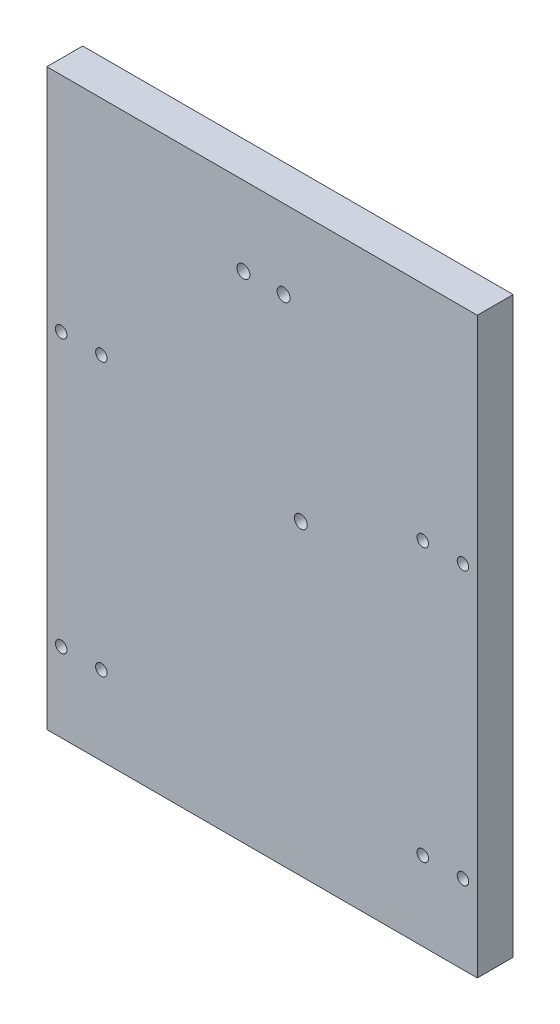
ISO-10303-21;
HEADER;
FILE_DESCRIPTION(('STEP AP214'),'2;1');
FILE_NAME('part.step','',(''),(''),'','','');
FILE_SCHEMA(('AUTOMOTIVE_DESIGN { 1 0 10303 214 1 1 1 1 }'));
ENDSEC;
DATA;
#1=APPLICATION_CONTEXT('core data for automotive mechanical design processes');
#2=APPLICATION_PROTOCOL_DEFINITION('international standard','automotive_design',2000,#1);
#3=PRODUCT_CONTEXT('',#1,'mechanical');
#4=PRODUCT('Part','Part','',(#3));
#5=PRODUCT_RELATED_PRODUCT_CATEGORY('part','',(#4));
#6=PRODUCT_DEFINITION_FORMATION('','',#4);
#7=PRODUCT_DEFINITION_CONTEXT('part definition',#1,'design');
#8=PRODUCT_DEFINITION('design','',#6,#7);
#9=PRODUCT_DEFINITION_SHAPE('','',#8);
#10=(LENGTH_UNIT() NAMED_UNIT(*) SI_UNIT(.MILLI.,.METRE.));
#11=(NAMED_UNIT(*) PLANE_ANGLE_UNIT() SI_UNIT($,.RADIAN.));
#12=(NAMED_UNIT(*) SI_UNIT($,.STERADIAN.) SOLID_ANGLE_UNIT());
#13=UNCERTAINTY_MEASURE_WITH_UNIT(LENGTH_MEASURE(1.E-05),#10,'distance_accuracy_value','');
#14=(GEOMETRIC_REPRESENTATION_CONTEXT(3) GLOBAL_UNCERTAINTY_ASSIGNED_CONTEXT((#13)) GLOBAL_UNIT_ASSIGNED_CONTEXT((#10,
#11,#12)) REPRESENTATION_CONTEXT('',''));
#15=CARTESIAN_POINT('',(0.,0.,0.));
#16=DIRECTION('',(0.,0.,1.));
#17=DIRECTION('',(1.,0.,0.));
#18=AXIS2_PLACEMENT_3D('',#15,#16,#17);
#19=CARTESIAN_POINT('',(150.,200.,-25.));
#20=DIRECTION('',(1.,0.,0.));
#21=DIRECTION('',(0.,1.,0.));
#22=AXIS2_PLACEMENT_3D('',#19,#20,#21);
#23=PLANE('',#22);
#24=DIRECTION('',(0.,1.,0.));
#25=VECTOR('',#24,1.);
#26=CARTESIAN_POINT('',(150.,200.,0.));
#27=LINE('',#26,#25);
#28=CARTESIAN_POINT('',(150.,-200.,0.));
#29=VERTEX_POINT('',#28);
#30=CARTESIAN_POINT('',(150.,200.,0.));
#31=VERTEX_POINT('',#30);
#32=EDGE_CURVE('E110',#29,#31,#27,.T.);
#33=ORIENTED_EDGE('',*,*,#32,.F.);
#34=DIRECTION('',(0.,0.,1.));
#35=VECTOR('',#34,1.);
#36=CARTESIAN_POINT('',(150.,-200.,-25.));
#37=LINE('',#36,#35);
#38=CARTESIAN_POINT('',(150.,-200.,-25.));
#39=VERTEX_POINT('',#38);
#40=EDGE_CURVE('E11',#39,#29,#37,.T.);
#41=ORIENTED_EDGE('',*,*,#40,.F.);
#42=DIRECTION('',(0.,1.,0.));
#43=VECTOR('',#42,1.);
#44=CARTESIAN_POINT('',(150.,200.,-25.));
#45=LINE('',#44,#43);
#46=CARTESIAN_POINT('',(150.,200.,-25.));
#47=VERTEX_POINT('',#46);
#48=EDGE_CURVE('E101',#39,#47,#45,.T.);
#49=ORIENTED_EDGE('',*,*,#48,.T.);
#50=DIRECTION('',(0.,0.,1.));
#51=VECTOR('',#50,1.);
#52=CARTESIAN_POINT('',(150.,200.,-25.));
#53=LINE('',#52,#51);
#54=EDGE_CURVE('E42',#47,#31,#53,.T.);
#55=ORIENTED_EDGE('',*,*,#54,.T.);
#56=EDGE_LOOP('',(#33,#41,#49,#55));
#57=FACE_BOUND('',#56,.T.);
#58=ADVANCED_FACE('F39',(#57),#23,.T.);
#59=CARTESIAN_POINT('',(-150.,-200.,-25.));
#60=DIRECTION('',(0.,-1.,0.));
#61=DIRECTION('',(0.,0.,-1.));
#62=AXIS2_PLACEMENT_3D('',#59,#60,#61);
#63=PLANE('',#62);
#64=DIRECTION('',(1.,0.,0.));
#65=VECTOR('',#64,1.);
#66=CARTESIAN_POINT('',(-150.,-200.,0.));
#67=LINE('',#66,#65);
#68=CARTESIAN_POINT('',(-150.,-200.,0.));
#69=VERTEX_POINT('',#68);
#70=EDGE_CURVE('E104',#69,#29,#67,.T.);
#71=ORIENTED_EDGE('',*,*,#70,.F.);
#72=DIRECTION('',(0.,0.,1.));
#73=VECTOR('',#72,1.);
#74=CARTESIAN_POINT('',(-150.,-200.,-25.));
#75=LINE('',#74,#73);
#76=CARTESIAN_POINT('',(-150.,-200.,-25.));
#77=VERTEX_POINT('',#76);
#78=EDGE_CURVE('E49',#77,#69,#75,.T.);
#79=ORIENTED_EDGE('',*,*,#78,.F.);
#80=DIRECTION('',(1.,0.,0.));
#81=VECTOR('',#80,1.);
#82=CARTESIAN_POINT('',(-150.,-200.,-25.));
#83=LINE('',#82,#81);
#84=EDGE_CURVE('E96',#77,#39,#83,.T.);
#85=ORIENTED_EDGE('',*,*,#84,.T.);
#86=ORIENTED_EDGE('',*,*,#40,.T.);
#87=EDGE_LOOP('',(#71,#79,#85,#86));
#88=FACE_BOUND('',#87,.T.);
#89=ADVANCED_FACE('F127',(#88),#63,.T.);
#90=CARTESIAN_POINT('',(-150.,200.,-25.));
#91=DIRECTION('',(-1.,0.,0.));
#92=DIRECTION('',(0.,-1.,0.));
#93=AXIS2_PLACEMENT_3D('',#90,#91,#92);
#94=PLANE('',#93);
#95=DIRECTION('',(0.,-1.,0.));
#96=VECTOR('',#95,1.);
#97=CARTESIAN_POINT('',(-150.,200.,0.));
#98=LINE('',#97,#96);
#99=CARTESIAN_POINT('',(-150.,200.,0.));
#100=VERTEX_POINT('',#99);
#101=EDGE_CURVE('E90',#100,#69,#98,.T.);
#102=ORIENTED_EDGE('',*,*,#101,.F.);
#103=DIRECTION('',(0.,0.,1.));
#104=VECTOR('',#103,1.);
#105=CARTESIAN_POINT('',(-150.,200.,-25.));
#106=LINE('',#105,#104);
#107=CARTESIAN_POINT('',(-150.,200.,-25.));
#108=VERTEX_POINT('',#107);
#109=EDGE_CURVE('E85',#108,#100,#106,.T.);
#110=ORIENTED_EDGE('',*,*,#109,.F.);
#111=DIRECTION('',(0.,-1.,0.));
#112=VECTOR('',#111,1.);
#113=CARTESIAN_POINT('',(-150.,200.,-25.));
#114=LINE('',#113,#112);
#115=EDGE_CURVE('E88',#108,#77,#114,.T.);
#116=ORIENTED_EDGE('',*,*,#115,.T.);
#117=ORIENTED_EDGE('',*,*,#78,.T.);
#118=EDGE_LOOP('',(#102,#110,#116,#117));
#119=FACE_BOUND('',#118,.T.);
#120=ADVANCED_FACE('F87',(#119),#94,.T.);
#121=CARTESIAN_POINT('',(-150.,200.,-25.));
#122=DIRECTION('',(0.,1.,0.));
#123=DIRECTION('',(0.,0.,1.));
#124=AXIS2_PLACEMENT_3D('',#121,#122,#123);
#125=PLANE('',#124);
#126=DIRECTION('',(-1.,0.,0.));
#127=VECTOR('',#126,1.);
#128=CARTESIAN_POINT('',(-150.,200.,0.));
#129=LINE('',#128,#127);
#130=EDGE_CURVE('E114',#31,#100,#129,.T.);
#131=ORIENTED_EDGE('',*,*,#130,.F.);
#132=ORIENTED_EDGE('',*,*,#54,.F.);
#133=DIRECTION('',(-1.,0.,0.));
#134=VECTOR('',#133,1.);
#135=CARTESIAN_POINT('',(-150.,200.,-25.));
#136=LINE('',#135,#134);
#137=EDGE_CURVE('E95',#47,#108,#136,.T.);
#138=ORIENTED_EDGE('',*,*,#137,.T.);
#139=ORIENTED_EDGE('',*,*,#109,.T.);
#140=EDGE_LOOP('',(#131,#132,#138,#139));
#141=FACE_BOUND('',#140,.T.);
#142=ADVANCED_FACE('F99',(#141),#125,.T.);
#143=CARTESIAN_POINT('',(0.,0.,-25.));
#144=DIRECTION('',(0.,0.,1.));
#145=DIRECTION('',(1.,0.,0.));
#146=AXIS2_PLACEMENT_3D('',#143,#144,#145);
#147=PLANE('',#146);
#148=CARTESIAN_POINT('',(-140.,45.,-25.));
#149=DIRECTION('',(0.,0.,1.));
#150=DIRECTION('',(-1.,0.,0.));
#151=AXIS2_PLACEMENT_3D('',#148,#149,#150);
#152=CIRCLE('',#151,3.99999999999999);
#153=CARTESIAN_POINT('',(-144.,45.,-25.));
#154=VERTEX_POINT('',#153);
#155=EDGE_CURVE('E196',#154,#154,#152,.T.);
#156=ORIENTED_EDGE('',*,*,#155,.T.);
#157=EDGE_LOOP('',(#156));
#158=FACE_BOUND('',#157,.T.);
#159=CARTESIAN_POINT('',(-112.,45.,-25.));
#160=DIRECTION('',(0.,0.,1.));
#161=DIRECTION('',(-1.,0.,0.));
#162=AXIS2_PLACEMENT_3D('',#159,#160,#161);
#163=CIRCLE('',#162,4.00000000000001);
#164=CARTESIAN_POINT('',(-116.,45.,-25.));
#165=VERTEX_POINT('',#164);
#166=EDGE_CURVE('E206',#165,#165,#163,.T.);
#167=ORIENTED_EDGE('',*,*,#166,.T.);
#168=EDGE_LOOP('',(#167));
#169=FACE_BOUND('',#168,.T.);
#170=CARTESIAN_POINT('',(112.,44.9999999999999,-25.));
#171=DIRECTION('',(0.,0.,1.));
#172=DIRECTION('',(1.,0.,0.));
#173=AXIS2_PLACEMENT_3D('',#170,#171,#172);
#174=CIRCLE('',#173,4.00000000000001);
#175=CARTESIAN_POINT('',(116.,44.9999999999999,-25.));
#176=VERTEX_POINT('',#175);
#177=EDGE_CURVE('E214',#176,#176,#174,.T.);
#178=ORIENTED_EDGE('',*,*,#177,.T.);
#179=EDGE_LOOP('',(#178));
#180=FACE_BOUND('',#179,.T.);
#181=CARTESIAN_POINT('',(140.,44.9999999999999,-25.));
#182=DIRECTION('',(0.,0.,1.));
#183=DIRECTION('',(1.,0.,0.));
#184=AXIS2_PLACEMENT_3D('',#181,#182,#183);
#185=CIRCLE('',#184,3.99999999999999);
#186=CARTESIAN_POINT('',(144.,44.9999999999999,-25.));
#187=VERTEX_POINT('',#186);
#188=EDGE_CURVE('E222',#187,#187,#185,.T.);
#189=ORIENTED_EDGE('',*,*,#188,.T.);
#190=EDGE_LOOP('',(#189));
#191=FACE_BOUND('',#190,.T.);
#192=CARTESIAN_POINT('',(27.,14.,-25.));
#193=DIRECTION('',(0.,0.,1.));
#194=DIRECTION('',(1.,0.,0.));
#195=AXIS2_PLACEMENT_3D('',#192,#193,#194);
#196=CIRCLE('',#195,4.5);
#197=CARTESIAN_POINT('',(31.5,14.,-25.));
#198=VERTEX_POINT('',#197);
#199=EDGE_CURVE('E230',#198,#198,#196,.T.);
#200=ORIENTED_EDGE('',*,*,#199,.T.);
#201=EDGE_LOOP('',(#200));
#202=FACE_BOUND('',#201,.T.);
#203=CARTESIAN_POINT('',(-13.,145.,-25.));
#204=DIRECTION('',(0.,0.,1.));
#205=DIRECTION('',(1.,0.,0.));
#206=AXIS2_PLACEMENT_3D('',#203,#204,#205);
#207=CIRCLE('',#206,4.50000000000001);
#208=CARTESIAN_POINT('',(-8.50000000000004,145.,-25.));
#209=VERTEX_POINT('',#208);
#210=EDGE_CURVE('E238',#209,#209,#207,.T.);
#211=ORIENTED_EDGE('',*,*,#210,.T.);
#212=EDGE_LOOP('',(#211));
#213=FACE_BOUND('',#212,.T.);
#214=CARTESIAN_POINT('',(15.,145.,-25.));
#215=DIRECTION('',(0.,0.,1.));
#216=DIRECTION('',(1.,0.,0.));
#217=AXIS2_PLACEMENT_3D('',#214,#215,#216);
#218=CIRCLE('',#217,4.50000000000001);
#219=CARTESIAN_POINT('',(19.5,145.,-25.));
#220=VERTEX_POINT('',#219);
#221=EDGE_CURVE('E246',#220,#220,#218,.T.);
#222=ORIENTED_EDGE('',*,*,#221,.T.);
#223=EDGE_LOOP('',(#222));
#224=FACE_BOUND('',#223,.T.);
#225=CARTESIAN_POINT('',(140.,-145.,-25.));
#226=DIRECTION('',(0.,0.,1.));
#227=DIRECTION('',(-1.,0.,0.));
#228=AXIS2_PLACEMENT_3D('',#225,#226,#227);
#229=CIRCLE('',#228,3.99999999999999);
#230=CARTESIAN_POINT('',(136.,-145.,-25.));
#231=VERTEX_POINT('',#230);
#232=EDGE_CURVE('E254',#231,#231,#229,.T.);
#233=ORIENTED_EDGE('',*,*,#232,.T.);
#234=EDGE_LOOP('',(#233));
#235=FACE_BOUND('',#234,.T.);
#236=CARTESIAN_POINT('',(112.,-145.,-25.));
#237=DIRECTION('',(0.,0.,1.));
#238=DIRECTION('',(-1.,0.,0.));
#239=AXIS2_PLACEMENT_3D('',#236,#237,#238);
#240=CIRCLE('',#239,4.00000000000001);
#241=CARTESIAN_POINT('',(108.,-145.,-25.));
#242=VERTEX_POINT('',#241);
#243=EDGE_CURVE('E262',#242,#242,#240,.T.);
#244=ORIENTED_EDGE('',*,*,#243,.T.);
#245=EDGE_LOOP('',(#244));
#246=FACE_BOUND('',#245,.T.);
#247=CARTESIAN_POINT('',(-140.,-145.,-25.));
#248=DIRECTION('',(0.,0.,1.));
#249=DIRECTION('',(1.,0.,0.));
#250=AXIS2_PLACEMENT_3D('',#247,#248,#249);
#251=CIRCLE('',#250,3.99999999999999);
#252=CARTESIAN_POINT('',(-136.,-145.,-25.));
#253=VERTEX_POINT('',#252);
#254=EDGE_CURVE('E270',#253,#253,#251,.T.);
#255=ORIENTED_EDGE('',*,*,#254,.T.);
#256=EDGE_LOOP('',(#255));
#257=FACE_BOUND('',#256,.T.);
#258=CARTESIAN_POINT('',(-112.,-145.,-25.));
#259=DIRECTION('',(0.,0.,1.));
#260=DIRECTION('',(1.,0.,0.));
#261=AXIS2_PLACEMENT_3D('',#258,#259,#260);
#262=CIRCLE('',#261,4.00000000000001);
#263=CARTESIAN_POINT('',(-108.,-145.,-25.));
#264=VERTEX_POINT('',#263);
#265=EDGE_CURVE('E115',#264,#264,#262,.T.);
#266=ORIENTED_EDGE('',*,*,#265,.T.);
#267=EDGE_LOOP('',(#266));
#268=FACE_BOUND('',#267,.T.);
#269=ORIENTED_EDGE('',*,*,#48,.F.);
#270=ORIENTED_EDGE('',*,*,#84,.F.);
#271=ORIENTED_EDGE('',*,*,#115,.F.);
#272=ORIENTED_EDGE('',*,*,#137,.F.);
#273=EDGE_LOOP('',(#269,#270,#271,#272));
#274=FACE_BOUND('',#273,.T.);
#275=ADVANCED_FACE('F94',(#158,#169,#180,#191,#202,#213,#224,#235,#246,#257,#268,#274),#147,.F.);
#276=CARTESIAN_POINT('',(0.,0.,0.));
#277=DIRECTION('',(0.,0.,1.));
#278=DIRECTION('',(1.,0.,0.));
#279=AXIS2_PLACEMENT_3D('',#276,#277,#278);
#280=PLANE('',#279);
#281=CARTESIAN_POINT('',(-140.,45.,0.));
#282=DIRECTION('',(0.,0.,1.));
#283=DIRECTION('',(-1.,0.,0.));
#284=AXIS2_PLACEMENT_3D('',#281,#282,#283);
#285=CIRCLE('',#284,3.99999999999999);
#286=CARTESIAN_POINT('',(-144.,45.,0.));
#287=VERTEX_POINT('',#286);
#288=EDGE_CURVE('E199',#287,#287,#285,.T.);
#289=ORIENTED_EDGE('',*,*,#288,.F.);
#290=EDGE_LOOP('',(#289));
#291=FACE_BOUND('',#290,.T.);
#292=CARTESIAN_POINT('',(-112.,45.,0.));
#293=DIRECTION('',(0.,0.,1.));
#294=DIRECTION('',(-1.,0.,0.));
#295=AXIS2_PLACEMENT_3D('',#292,#293,#294);
#296=CIRCLE('',#295,4.00000000000001);
#297=CARTESIAN_POINT('',(-116.,45.,0.));
#298=VERTEX_POINT('',#297);
#299=EDGE_CURVE('E203',#298,#298,#296,.T.);
#300=ORIENTED_EDGE('',*,*,#299,.F.);
#301=EDGE_LOOP('',(#300));
#302=FACE_BOUND('',#301,.T.);
#303=CARTESIAN_POINT('',(112.,44.9999999999999,0.));
#304=DIRECTION('',(0.,0.,1.));
#305=DIRECTION('',(1.,0.,0.));
#306=AXIS2_PLACEMENT_3D('',#303,#304,#305);
#307=CIRCLE('',#306,4.00000000000001);
#308=CARTESIAN_POINT('',(116.,44.9999999999999,0.));
#309=VERTEX_POINT('',#308);
#310=EDGE_CURVE('E210',#309,#309,#307,.T.);
#311=ORIENTED_EDGE('',*,*,#310,.F.);
#312=EDGE_LOOP('',(#311));
#313=FACE_BOUND('',#312,.T.);
#314=CARTESIAN_POINT('',(140.,44.9999999999999,0.));
#315=DIRECTION('',(0.,0.,1.));
#316=DIRECTION('',(1.,0.,0.));
#317=AXIS2_PLACEMENT_3D('',#314,#315,#316);
#318=CIRCLE('',#317,3.99999999999999);
#319=CARTESIAN_POINT('',(144.,44.9999999999999,0.));
#320=VERTEX_POINT('',#319);
#321=EDGE_CURVE('E218',#320,#320,#318,.T.);
#322=ORIENTED_EDGE('',*,*,#321,.F.);
#323=EDGE_LOOP('',(#322));
#324=FACE_BOUND('',#323,.T.);
#325=CARTESIAN_POINT('',(27.,14.,0.));
#326=DIRECTION('',(0.,0.,1.));
#327=DIRECTION('',(1.,0.,0.));
#328=AXIS2_PLACEMENT_3D('',#325,#326,#327);
#329=CIRCLE('',#328,4.5);
#330=CARTESIAN_POINT('',(31.5,14.,0.));
#331=VERTEX_POINT('',#330);
#332=EDGE_CURVE('E226',#331,#331,#329,.T.);
#333=ORIENTED_EDGE('',*,*,#332,.F.);
#334=EDGE_LOOP('',(#333));
#335=FACE_BOUND('',#334,.T.);
#336=CARTESIAN_POINT('',(-13.,145.,0.));
#337=DIRECTION('',(0.,0.,1.));
#338=DIRECTION('',(1.,0.,0.));
#339=AXIS2_PLACEMENT_3D('',#336,#337,#338);
#340=CIRCLE('',#339,4.50000000000001);
#341=CARTESIAN_POINT('',(-8.50000000000004,145.,0.));
#342=VERTEX_POINT('',#341);
#343=EDGE_CURVE('E234',#342,#342,#340,.T.);
#344=ORIENTED_EDGE('',*,*,#343,.F.);
#345=EDGE_LOOP('',(#344));
#346=FACE_BOUND('',#345,.T.);
#347=CARTESIAN_POINT('',(15.,145.,0.));
#348=DIRECTION('',(0.,0.,1.));
#349=DIRECTION('',(1.,0.,0.));
#350=AXIS2_PLACEMENT_3D('',#347,#348,#349);
#351=CIRCLE('',#350,4.50000000000001);
#352=CARTESIAN_POINT('',(19.5,145.,0.));
#353=VERTEX_POINT('',#352);
#354=EDGE_CURVE('E242',#353,#353,#351,.T.);
#355=ORIENTED_EDGE('',*,*,#354,.F.);
#356=EDGE_LOOP('',(#355));
#357=FACE_BOUND('',#356,.T.);
#358=CARTESIAN_POINT('',(140.,-145.,0.));
#359=DIRECTION('',(0.,0.,1.));
#360=DIRECTION('',(-1.,0.,0.));
#361=AXIS2_PLACEMENT_3D('',#358,#359,#360);
#362=CIRCLE('',#361,3.99999999999999);
#363=CARTESIAN_POINT('',(136.,-145.,0.));
#364=VERTEX_POINT('',#363);
#365=EDGE_CURVE('E250',#364,#364,#362,.T.);
#366=ORIENTED_EDGE('',*,*,#365,.F.);
#367=EDGE_LOOP('',(#366));
#368=FACE_BOUND('',#367,.T.);
#369=CARTESIAN_POINT('',(112.,-145.,0.));
#370=DIRECTION('',(0.,0.,1.));
#371=DIRECTION('',(-1.,0.,0.));
#372=AXIS2_PLACEMENT_3D('',#369,#370,#371);
#373=CIRCLE('',#372,4.00000000000001);
#374=CARTESIAN_POINT('',(108.,-145.,0.));
#375=VERTEX_POINT('',#374);
#376=EDGE_CURVE('E258',#375,#375,#373,.T.);
#377=ORIENTED_EDGE('',*,*,#376,.F.);
#378=EDGE_LOOP('',(#377));
#379=FACE_BOUND('',#378,.T.);
#380=CARTESIAN_POINT('',(-140.,-145.,0.));
#381=DIRECTION('',(0.,0.,1.));
#382=DIRECTION('',(1.,0.,0.));
#383=AXIS2_PLACEMENT_3D('',#380,#381,#382);
#384=CIRCLE('',#383,3.99999999999999);
#385=CARTESIAN_POINT('',(-136.,-145.,0.));
#386=VERTEX_POINT('',#385);
#387=EDGE_CURVE('E266',#386,#386,#384,.T.);
#388=ORIENTED_EDGE('',*,*,#387,.F.);
#389=EDGE_LOOP('',(#388));
#390=FACE_BOUND('',#389,.T.);
#391=CARTESIAN_POINT('',(-112.,-145.,0.));
#392=DIRECTION('',(0.,0.,1.));
#393=DIRECTION('',(1.,0.,0.));
#394=AXIS2_PLACEMENT_3D('',#391,#392,#393);
#395=CIRCLE('',#394,4.00000000000001);
#396=CARTESIAN_POINT('',(-108.,-145.,0.));
#397=VERTEX_POINT('',#396);
#398=EDGE_CURVE('E274',#397,#397,#395,.T.);
#399=ORIENTED_EDGE('',*,*,#398,.F.);
#400=EDGE_LOOP('',(#399));
#401=FACE_BOUND('',#400,.T.);
#402=ORIENTED_EDGE('',*,*,#32,.T.);
#403=ORIENTED_EDGE('',*,*,#130,.T.);
#404=ORIENTED_EDGE('',*,*,#101,.T.);
#405=ORIENTED_EDGE('',*,*,#70,.T.);
#406=EDGE_LOOP('',(#402,#403,#404,#405));
#407=FACE_BOUND('',#406,.T.);
#408=ADVANCED_FACE('F126',(#291,#302,#313,#324,#335,#346,#357,#368,#379,#390,#401,#407),#280,.T.);
#409=CARTESIAN_POINT('',(-112.,-145.,-25.));
#410=DIRECTION('',(0.,0.,1.));
#411=DIRECTION('',(1.,0.,0.));
#412=AXIS2_PLACEMENT_3D('',#409,#410,#411);
#413=CYLINDRICAL_SURFACE('',#412,4.00000000000001);
#414=ORIENTED_EDGE('',*,*,#265,.F.);
#415=EDGE_LOOP('',(#414));
#416=FACE_BOUND('',#415,.T.);
#417=ORIENTED_EDGE('',*,*,#398,.T.);
#418=EDGE_LOOP('',(#417));
#419=FACE_BOUND('',#418,.T.);
#420=ADVANCED_FACE('F145',(#416,#419),#413,.F.);
#421=CARTESIAN_POINT('',(-140.,-145.,-25.));
#422=DIRECTION('',(0.,0.,1.));
#423=DIRECTION('',(1.,0.,0.));
#424=AXIS2_PLACEMENT_3D('',#421,#422,#423);
#425=CYLINDRICAL_SURFACE('',#424,3.99999999999999);
#426=ORIENTED_EDGE('',*,*,#254,.F.);
#427=EDGE_LOOP('',(#426));
#428=FACE_BOUND('',#427,.T.);
#429=ORIENTED_EDGE('',*,*,#387,.T.);
#430=EDGE_LOOP('',(#429));
#431=FACE_BOUND('',#430,.T.);
#432=ADVANCED_FACE('F152',(#428,#431),#425,.F.);
#433=CARTESIAN_POINT('',(112.,-145.,-25.));
#434=DIRECTION('',(0.,0.,1.));
#435=DIRECTION('',(1.,0.,0.));
#436=AXIS2_PLACEMENT_3D('',#433,#434,#435);
#437=CYLINDRICAL_SURFACE('',#436,4.00000000000001);
#438=ORIENTED_EDGE('',*,*,#243,.F.);
#439=EDGE_LOOP('',(#438));
#440=FACE_BOUND('',#439,.T.);
#441=ORIENTED_EDGE('',*,*,#376,.T.);
#442=EDGE_LOOP('',(#441));
#443=FACE_BOUND('',#442,.T.);
#444=ADVANCED_FACE('F156',(#440,#443),#437,.F.);
#445=CARTESIAN_POINT('',(140.,-145.,-25.));
#446=DIRECTION('',(0.,0.,1.));
#447=DIRECTION('',(1.,0.,0.));
#448=AXIS2_PLACEMENT_3D('',#445,#446,#447);
#449=CYLINDRICAL_SURFACE('',#448,3.99999999999999);
#450=ORIENTED_EDGE('',*,*,#232,.F.);
#451=EDGE_LOOP('',(#450));
#452=FACE_BOUND('',#451,.T.);
#453=ORIENTED_EDGE('',*,*,#365,.T.);
#454=EDGE_LOOP('',(#453));
#455=FACE_BOUND('',#454,.T.);
#456=ADVANCED_FACE('F160',(#452,#455),#449,.F.);
#457=CARTESIAN_POINT('',(15.,145.,-25.));
#458=DIRECTION('',(0.,0.,1.));
#459=DIRECTION('',(1.,0.,0.));
#460=AXIS2_PLACEMENT_3D('',#457,#458,#459);
#461=CYLINDRICAL_SURFACE('',#460,4.50000000000001);
#462=ORIENTED_EDGE('',*,*,#221,.F.);
#463=EDGE_LOOP('',(#462));
#464=FACE_BOUND('',#463,.T.);
#465=ORIENTED_EDGE('',*,*,#354,.T.);
#466=EDGE_LOOP('',(#465));
#467=FACE_BOUND('',#466,.T.);
#468=ADVANCED_FACE('F164',(#464,#467),#461,.F.);
#469=CARTESIAN_POINT('',(-13.,145.,-25.));
#470=DIRECTION('',(0.,0.,1.));
#471=DIRECTION('',(1.,0.,0.));
#472=AXIS2_PLACEMENT_3D('',#469,#470,#471);
#473=CYLINDRICAL_SURFACE('',#472,4.50000000000001);
#474=ORIENTED_EDGE('',*,*,#210,.F.);
#475=EDGE_LOOP('',(#474));
#476=FACE_BOUND('',#475,.T.);
#477=ORIENTED_EDGE('',*,*,#343,.T.);
#478=EDGE_LOOP('',(#477));
#479=FACE_BOUND('',#478,.T.);
#480=ADVANCED_FACE('F168',(#476,#479),#473,.F.);
#481=CARTESIAN_POINT('',(27.,14.,-25.));
#482=DIRECTION('',(0.,0.,1.));
#483=DIRECTION('',(1.,0.,0.));
#484=AXIS2_PLACEMENT_3D('',#481,#482,#483);
#485=CYLINDRICAL_SURFACE('',#484,4.5);
#486=ORIENTED_EDGE('',*,*,#199,.F.);
#487=EDGE_LOOP('',(#486));
#488=FACE_BOUND('',#487,.T.);
#489=ORIENTED_EDGE('',*,*,#332,.T.);
#490=EDGE_LOOP('',(#489));
#491=FACE_BOUND('',#490,.T.);
#492=ADVANCED_FACE('F172',(#488,#491),#485,.F.);
#493=CARTESIAN_POINT('',(140.,44.9999999999999,-25.));
#494=DIRECTION('',(0.,0.,1.));
#495=DIRECTION('',(1.,0.,0.));
#496=AXIS2_PLACEMENT_3D('',#493,#494,#495);
#497=CYLINDRICAL_SURFACE('',#496,3.99999999999999);
#498=ORIENTED_EDGE('',*,*,#188,.F.);
#499=EDGE_LOOP('',(#498));
#500=FACE_BOUND('',#499,.T.);
#501=ORIENTED_EDGE('',*,*,#321,.T.);
#502=EDGE_LOOP('',(#501));
#503=FACE_BOUND('',#502,.T.);
#504=ADVANCED_FACE('F176',(#500,#503),#497,.F.);
#505=CARTESIAN_POINT('',(112.,44.9999999999999,-25.));
#506=DIRECTION('',(0.,0.,1.));
#507=DIRECTION('',(1.,0.,0.));
#508=AXIS2_PLACEMENT_3D('',#505,#506,#507);
#509=CYLINDRICAL_SURFACE('',#508,4.00000000000001);
#510=ORIENTED_EDGE('',*,*,#177,.F.);
#511=EDGE_LOOP('',(#510));
#512=FACE_BOUND('',#511,.T.);
#513=ORIENTED_EDGE('',*,*,#310,.T.);
#514=EDGE_LOOP('',(#513));
#515=FACE_BOUND('',#514,.T.);
#516=ADVANCED_FACE('F180',(#512,#515),#509,.F.);
#517=CARTESIAN_POINT('',(-112.,45.,-25.));
#518=DIRECTION('',(0.,0.,1.));
#519=DIRECTION('',(1.,0.,0.));
#520=AXIS2_PLACEMENT_3D('',#517,#518,#519);
#521=CYLINDRICAL_SURFACE('',#520,4.00000000000001);
#522=ORIENTED_EDGE('',*,*,#166,.F.);
#523=EDGE_LOOP('',(#522));
#524=FACE_BOUND('',#523,.T.);
#525=ORIENTED_EDGE('',*,*,#299,.T.);
#526=EDGE_LOOP('',(#525));
#527=FACE_BOUND('',#526,.T.);
#528=ADVANCED_FACE('F184',(#524,#527),#521,.F.);
#529=CARTESIAN_POINT('',(-140.,45.,-25.));
#530=DIRECTION('',(0.,0.,1.));
#531=DIRECTION('',(1.,0.,0.));
#532=AXIS2_PLACEMENT_3D('',#529,#530,#531);
#533=CYLINDRICAL_SURFACE('',#532,3.99999999999999);
#534=ORIENTED_EDGE('',*,*,#155,.F.);
#535=EDGE_LOOP('',(#534));
#536=FACE_BOUND('',#535,.T.);
#537=ORIENTED_EDGE('',*,*,#288,.T.);
#538=EDGE_LOOP('',(#537));
#539=FACE_BOUND('',#538,.T.);
#540=ADVANCED_FACE('F188',(#536,#539),#533,.F.);
#541=CLOSED_SHELL('',(#58,#89,#120,#142,#275,#408,#420,#432,#444,#456,#468,#480,#492,#504,#516,
#528,#540));
#542=MANIFOLD_SOLID_BREP('B2',#541);
#543=ADVANCED_BREP_SHAPE_REPRESENTATION('',(#18,#542),#14);
#544=SHAPE_DEFINITION_REPRESENTATION(#9,#543);
ENDSEC;
END-ISO-10303-21;
